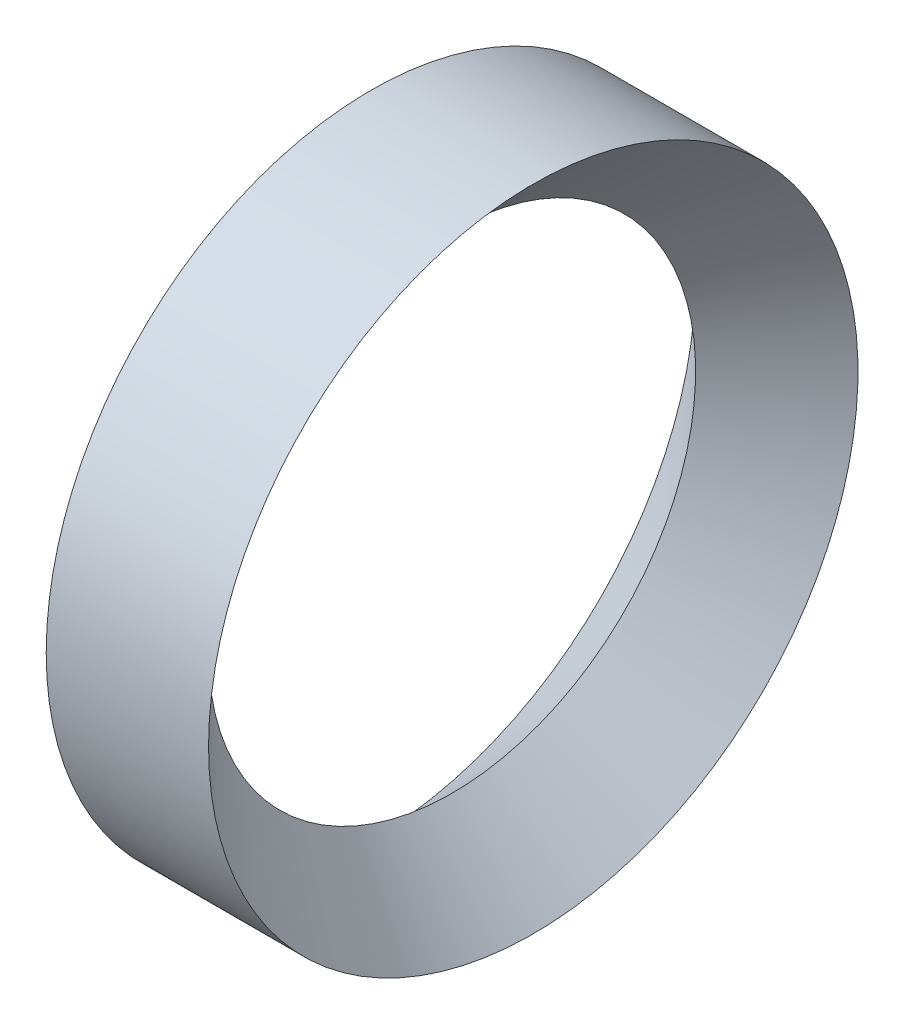
ISO-10303-21;
HEADER;
FILE_DESCRIPTION(('STEP AP214'),'2;1');
FILE_NAME('part.step','',(''),(''),'','','');
FILE_SCHEMA(('AUTOMOTIVE_DESIGN { 1 0 10303 214 1 1 1 1 }'));
ENDSEC;
DATA;
#1=APPLICATION_CONTEXT('core data for automotive mechanical design processes');
#2=APPLICATION_PROTOCOL_DEFINITION('international standard','automotive_design',2000,#1);
#3=PRODUCT_CONTEXT('',#1,'mechanical');
#4=PRODUCT('Part','Part','',(#3));
#5=PRODUCT_RELATED_PRODUCT_CATEGORY('part','',(#4));
#6=PRODUCT_DEFINITION_FORMATION('','',#4);
#7=PRODUCT_DEFINITION_CONTEXT('part definition',#1,'design');
#8=PRODUCT_DEFINITION('design','',#6,#7);
#9=PRODUCT_DEFINITION_SHAPE('','',#8);
#10=(LENGTH_UNIT() NAMED_UNIT(*) SI_UNIT(.MILLI.,.METRE.));
#11=(NAMED_UNIT(*) PLANE_ANGLE_UNIT() SI_UNIT($,.RADIAN.));
#12=(NAMED_UNIT(*) SI_UNIT($,.STERADIAN.) SOLID_ANGLE_UNIT());
#13=UNCERTAINTY_MEASURE_WITH_UNIT(LENGTH_MEASURE(1.E-05),#10,'distance_accuracy_value','');
#14=(GEOMETRIC_REPRESENTATION_CONTEXT(3) GLOBAL_UNCERTAINTY_ASSIGNED_CONTEXT((#13)) GLOBAL_UNIT_ASSIGNED_CONTEXT((#10,
#11,#12)) REPRESENTATION_CONTEXT('',''));
#15=CARTESIAN_POINT('',(0.,0.,0.));
#16=DIRECTION('',(0.,0.,1.));
#17=DIRECTION('',(1.,0.,0.));
#18=AXIS2_PLACEMENT_3D('',#15,#16,#17);
#19=CARTESIAN_POINT('',(-1.99999999999999,0.,0.));
#20=DIRECTION('',(-1.,0.,0.));
#21=DIRECTION('',(0.,0.,1.));
#22=AXIS2_PLACEMENT_3D('',#19,#20,#21);
#23=CONICAL_SURFACE('',#22,7.99999999999997,0.785398163397443);
#24=CARTESIAN_POINT('',(0.,0.,0.));
#25=DIRECTION('',(-1.,0.,0.));
#26=DIRECTION('',(0.,0.,1.));
#27=AXIS2_PLACEMENT_3D('',#24,#25,#26);
#28=CIRCLE('',#27,6.);
#29=CARTESIAN_POINT('',(0.,0.,6.));
#30=VERTEX_POINT('',#29);
#31=EDGE_CURVE('E41',#30,#30,#28,.T.);
#32=ORIENTED_EDGE('',*,*,#31,.F.);
#33=EDGE_LOOP('',(#32));
#34=FACE_BOUND('',#33,.T.);
#35=CARTESIAN_POINT('',(-1.99999999999999,0.,0.));
#36=DIRECTION('',(-1.,0.,0.));
#37=DIRECTION('',(0.,0.,1.));
#38=AXIS2_PLACEMENT_3D('',#35,#36,#37);
#39=CIRCLE('',#38,7.99999999999997);
#40=CARTESIAN_POINT('',(-1.99999999999999,0.,7.99999999999997));
#41=VERTEX_POINT('',#40);
#42=EDGE_CURVE('E10',#41,#41,#39,.T.);
#43=ORIENTED_EDGE('',*,*,#42,.T.);
#44=EDGE_LOOP('',(#43));
#45=FACE_BOUND('',#44,.T.);
#46=ADVANCED_FACE('F35',(#34,#45),#23,.F.);
#47=CARTESIAN_POINT('',(0.,0.,0.));
#48=DIRECTION('',(1.,0.,0.));
#49=DIRECTION('',(0.,0.,-1.));
#50=AXIS2_PLACEMENT_3D('',#47,#48,#49);
#51=CONICAL_SURFACE('',#50,6.,0.785398163397441);
#52=CARTESIAN_POINT('',(2.,0.,0.));
#53=DIRECTION('',(-1.,0.,0.));
#54=DIRECTION('',(0.,0.,1.));
#55=AXIS2_PLACEMENT_3D('',#52,#53,#54);
#56=CIRCLE('',#55,7.99999999999997);
#57=CARTESIAN_POINT('',(2.,0.,7.99999999999997));
#58=VERTEX_POINT('',#57);
#59=EDGE_CURVE('E45',#58,#58,#56,.T.);
#60=ORIENTED_EDGE('',*,*,#59,.F.);
#61=EDGE_LOOP('',(#60));
#62=FACE_BOUND('',#61,.T.);
#63=ORIENTED_EDGE('',*,*,#31,.T.);
#64=EDGE_LOOP('',(#63));
#65=FACE_BOUND('',#64,.T.);
#66=ADVANCED_FACE('F54',(#62,#65),#51,.F.);
#67=CARTESIAN_POINT('',(-52.3395170943257,0.,0.));
#68=DIRECTION('',(-1.,0.,0.));
#69=DIRECTION('',(0.,0.,1.));
#70=AXIS2_PLACEMENT_3D('',#67,#68,#69);
#71=CYLINDRICAL_SURFACE('',#70,7.99999999999997);
#72=ORIENTED_EDGE('',*,*,#42,.F.);
#73=EDGE_LOOP('',(#72));
#74=FACE_BOUND('',#73,.T.);
#75=ORIENTED_EDGE('',*,*,#59,.T.);
#76=EDGE_LOOP('',(#75));
#77=FACE_BOUND('',#76,.T.);
#78=ADVANCED_FACE('F52',(#74,#77),#71,.T.);
#79=CLOSED_SHELL('',(#46,#66,#78));
#80=MANIFOLD_SOLID_BREP('B2',#79);
#81=ADVANCED_BREP_SHAPE_REPRESENTATION('',(#18,#80),#14);
#82=SHAPE_DEFINITION_REPRESENTATION(#9,#81);
ENDSEC;
END-ISO-10303-21;
